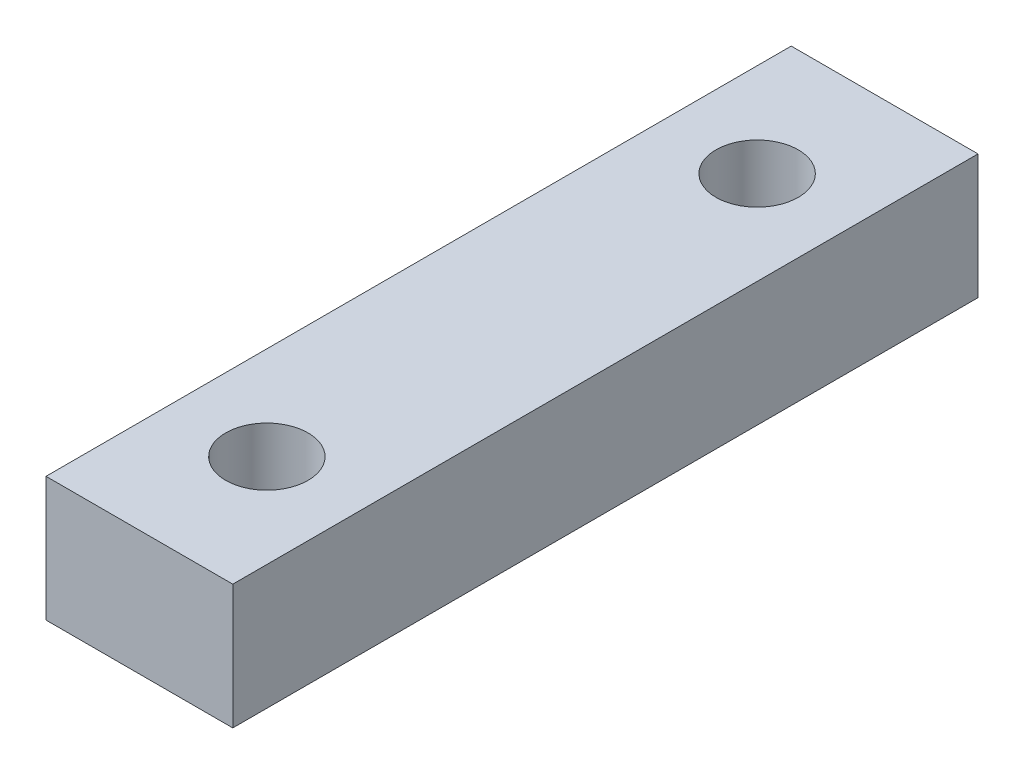
ISO-10303-21;
HEADER;
FILE_DESCRIPTION(('STEP AP214'),'2;1');
FILE_NAME('part.step','',(''),(''),'','','');
FILE_SCHEMA(('AUTOMOTIVE_DESIGN { 1 0 10303 214 1 1 1 1 }'));
ENDSEC;
DATA;
#1=APPLICATION_CONTEXT('core data for automotive mechanical design processes');
#2=APPLICATION_PROTOCOL_DEFINITION('international standard','automotive_design',2000,#1);
#3=PRODUCT_CONTEXT('',#1,'mechanical');
#4=PRODUCT('Part','Part','',(#3));
#5=PRODUCT_RELATED_PRODUCT_CATEGORY('part','',(#4));
#6=PRODUCT_DEFINITION_FORMATION('','',#4);
#7=PRODUCT_DEFINITION_CONTEXT('part definition',#1,'design');
#8=PRODUCT_DEFINITION('design','',#6,#7);
#9=PRODUCT_DEFINITION_SHAPE('','',#8);
#10=(LENGTH_UNIT() NAMED_UNIT(*) SI_UNIT(.MILLI.,.METRE.));
#11=(NAMED_UNIT(*) PLANE_ANGLE_UNIT() SI_UNIT($,.RADIAN.));
#12=(NAMED_UNIT(*) SI_UNIT($,.STERADIAN.) SOLID_ANGLE_UNIT());
#13=UNCERTAINTY_MEASURE_WITH_UNIT(LENGTH_MEASURE(1.E-05),#10,'distance_accuracy_value','');
#14=(GEOMETRIC_REPRESENTATION_CONTEXT(3) GLOBAL_UNCERTAINTY_ASSIGNED_CONTEXT((#13)) GLOBAL_UNIT_ASSIGNED_CONTEXT((#10,
#11,#12)) REPRESENTATION_CONTEXT('',''));
#15=CARTESIAN_POINT('',(0.,0.,0.));
#16=DIRECTION('',(0.,0.,1.));
#17=DIRECTION('',(1.,0.,0.));
#18=AXIS2_PLACEMENT_3D('',#15,#16,#17);
#19=CARTESIAN_POINT('',(-4.7625,3.175,19.));
#20=DIRECTION('',(1.,0.,0.));
#21=DIRECTION('',(0.,1.,0.));
#22=AXIS2_PLACEMENT_3D('',#19,#20,#21);
#23=PLANE('',#22);
#24=DIRECTION('',(0.,-1.,0.));
#25=VECTOR('',#24,1.);
#26=CARTESIAN_POINT('',(-4.7625,3.175,-19.));
#27=LINE('',#26,#25);
#28=CARTESIAN_POINT('',(-4.7625,3.175,-19.));
#29=VERTEX_POINT('',#28);
#30=CARTESIAN_POINT('',(-4.7625,-3.175,-19.));
#31=VERTEX_POINT('',#30);
#32=EDGE_CURVE('E99',#29,#31,#27,.T.);
#33=ORIENTED_EDGE('',*,*,#32,.T.);
#34=DIRECTION('',(0.,0.,-1.));
#35=VECTOR('',#34,1.);
#36=CARTESIAN_POINT('',(-4.7625,-3.175,19.));
#37=LINE('',#36,#35);
#38=CARTESIAN_POINT('',(-4.7625,-3.175,19.));
#39=VERTEX_POINT('',#38);
#40=EDGE_CURVE('E11',#39,#31,#37,.T.);
#41=ORIENTED_EDGE('',*,*,#40,.F.);
#42=DIRECTION('',(0.,-1.,0.));
#43=VECTOR('',#42,1.);
#44=CARTESIAN_POINT('',(-4.7625,3.175,19.));
#45=LINE('',#44,#43);
#46=CARTESIAN_POINT('',(-4.7625,3.175,19.));
#47=VERTEX_POINT('',#46);
#48=EDGE_CURVE('E87',#47,#39,#45,.T.);
#49=ORIENTED_EDGE('',*,*,#48,.F.);
#50=DIRECTION('',(0.,0.,-1.));
#51=VECTOR('',#50,1.);
#52=CARTESIAN_POINT('',(-4.7625,3.175,19.));
#53=LINE('',#52,#51);
#54=EDGE_CURVE('E95',#47,#29,#53,.T.);
#55=ORIENTED_EDGE('',*,*,#54,.T.);
#56=EDGE_LOOP('',(#33,#41,#49,#55));
#57=FACE_BOUND('',#56,.T.);
#58=ADVANCED_FACE('F36',(#57),#23,.F.);
#59=CARTESIAN_POINT('',(-4.7625,-3.175,19.));
#60=DIRECTION('',(0.,1.,0.));
#61=DIRECTION('',(0.,0.,1.));
#62=AXIS2_PLACEMENT_3D('',#59,#60,#61);
#63=PLANE('',#62);
#64=CARTESIAN_POINT('',(0.,-3.175,12.5));
#65=DIRECTION('',(0.,1.,0.));
#66=DIRECTION('',(0.,0.,1.));
#67=AXIS2_PLACEMENT_3D('',#64,#65,#66);
#68=CIRCLE('',#67,2.1);
#69=CARTESIAN_POINT('',(0.,-3.175,14.6));
#70=VERTEX_POINT('',#69);
#71=EDGE_CURVE('E118',#70,#70,#68,.T.);
#72=ORIENTED_EDGE('',*,*,#71,.T.);
#73=EDGE_LOOP('',(#72));
#74=FACE_BOUND('',#73,.T.);
#75=CARTESIAN_POINT('',(0.,-3.175,-12.5));
#76=DIRECTION('',(0.,1.,0.));
#77=DIRECTION('',(0.,0.,1.));
#78=AXIS2_PLACEMENT_3D('',#75,#76,#77);
#79=CIRCLE('',#78,2.1);
#80=CARTESIAN_POINT('',(0.,-3.175,-10.4));
#81=VERTEX_POINT('',#80);
#82=EDGE_CURVE('E102',#81,#81,#79,.T.);
#83=ORIENTED_EDGE('',*,*,#82,.T.);
#84=EDGE_LOOP('',(#83));
#85=FACE_BOUND('',#84,.T.);
#86=DIRECTION('',(1.,0.,0.));
#87=VECTOR('',#86,1.);
#88=CARTESIAN_POINT('',(-4.7625,-3.175,-19.));
#89=LINE('',#88,#87);
#90=CARTESIAN_POINT('',(4.7625,-3.175,-19.));
#91=VERTEX_POINT('',#90);
#92=EDGE_CURVE('E91',#31,#91,#89,.T.);
#93=ORIENTED_EDGE('',*,*,#92,.T.);
#94=DIRECTION('',(0.,0.,-1.));
#95=VECTOR('',#94,1.);
#96=CARTESIAN_POINT('',(4.7625,-3.175,19.));
#97=LINE('',#96,#95);
#98=CARTESIAN_POINT('',(4.7625,-3.175,19.));
#99=VERTEX_POINT('',#98);
#100=EDGE_CURVE('E44',#99,#91,#97,.T.);
#101=ORIENTED_EDGE('',*,*,#100,.F.);
#102=DIRECTION('',(1.,0.,0.));
#103=VECTOR('',#102,1.);
#104=CARTESIAN_POINT('',(-4.7625,-3.175,19.));
#105=LINE('',#104,#103);
#106=EDGE_CURVE('E82',#39,#99,#105,.T.);
#107=ORIENTED_EDGE('',*,*,#106,.F.);
#108=ORIENTED_EDGE('',*,*,#40,.T.);
#109=EDGE_LOOP('',(#93,#101,#107,#108));
#110=FACE_BOUND('',#109,.T.);
#111=ADVANCED_FACE('F90',(#74,#85,#110),#63,.F.);
#112=CARTESIAN_POINT('',(4.7625,3.175,19.));
#113=DIRECTION('',(-1.,0.,0.));
#114=DIRECTION('',(0.,-1.,0.));
#115=AXIS2_PLACEMENT_3D('',#112,#113,#114);
#116=PLANE('',#115);
#117=DIRECTION('',(0.,1.,0.));
#118=VECTOR('',#117,1.);
#119=CARTESIAN_POINT('',(4.7625,3.175,-19.));
#120=LINE('',#119,#118);
#121=CARTESIAN_POINT('',(4.7625,3.175,-19.));
#122=VERTEX_POINT('',#121);
#123=EDGE_CURVE('E69',#91,#122,#120,.T.);
#124=ORIENTED_EDGE('',*,*,#123,.T.);
#125=DIRECTION('',(0.,0.,-1.));
#126=VECTOR('',#125,1.);
#127=CARTESIAN_POINT('',(4.7625,3.175,19.));
#128=LINE('',#127,#126);
#129=CARTESIAN_POINT('',(4.7625,3.175,19.));
#130=VERTEX_POINT('',#129);
#131=EDGE_CURVE('E92',#130,#122,#128,.T.);
#132=ORIENTED_EDGE('',*,*,#131,.F.);
#133=DIRECTION('',(0.,1.,0.));
#134=VECTOR('',#133,1.);
#135=CARTESIAN_POINT('',(4.7625,3.175,19.));
#136=LINE('',#135,#134);
#137=EDGE_CURVE('E85',#99,#130,#136,.T.);
#138=ORIENTED_EDGE('',*,*,#137,.F.);
#139=ORIENTED_EDGE('',*,*,#100,.T.);
#140=EDGE_LOOP('',(#124,#132,#138,#139));
#141=FACE_BOUND('',#140,.T.);
#142=ADVANCED_FACE('F93',(#141),#116,.F.);
#143=CARTESIAN_POINT('',(-4.7625,3.175,19.));
#144=DIRECTION('',(0.,-1.,0.));
#145=DIRECTION('',(1.,0.,0.));
#146=AXIS2_PLACEMENT_3D('',#143,#144,#145);
#147=PLANE('',#146);
#148=CARTESIAN_POINT('',(0.,3.175,12.5));
#149=DIRECTION('',(0.,1.,0.));
#150=DIRECTION('',(0.,0.,1.));
#151=AXIS2_PLACEMENT_3D('',#148,#149,#150);
#152=CIRCLE('',#151,2.09999999999999);
#153=CARTESIAN_POINT('',(0.,3.175,14.6));
#154=VERTEX_POINT('',#153);
#155=EDGE_CURVE('E121',#154,#154,#152,.T.);
#156=ORIENTED_EDGE('',*,*,#155,.F.);
#157=EDGE_LOOP('',(#156));
#158=FACE_BOUND('',#157,.T.);
#159=CARTESIAN_POINT('',(0.,3.175,-12.5));
#160=DIRECTION('',(0.,1.,0.));
#161=DIRECTION('',(0.,0.,1.));
#162=AXIS2_PLACEMENT_3D('',#159,#160,#161);
#163=CIRCLE('',#162,2.09999999999999);
#164=CARTESIAN_POINT('',(0.,3.175,-10.4));
#165=VERTEX_POINT('',#164);
#166=EDGE_CURVE('E115',#165,#165,#163,.T.);
#167=ORIENTED_EDGE('',*,*,#166,.F.);
#168=EDGE_LOOP('',(#167));
#169=FACE_BOUND('',#168,.T.);
#170=DIRECTION('',(-1.,0.,0.));
#171=VECTOR('',#170,1.);
#172=CARTESIAN_POINT('',(-4.7625,3.175,-19.));
#173=LINE('',#172,#171);
#174=EDGE_CURVE('E75',#122,#29,#173,.T.);
#175=ORIENTED_EDGE('',*,*,#174,.T.);
#176=ORIENTED_EDGE('',*,*,#54,.F.);
#177=DIRECTION('',(-1.,0.,0.));
#178=VECTOR('',#177,1.);
#179=CARTESIAN_POINT('',(-4.7625,3.175,19.));
#180=LINE('',#179,#178);
#181=EDGE_CURVE('E52',#130,#47,#180,.T.);
#182=ORIENTED_EDGE('',*,*,#181,.F.);
#183=ORIENTED_EDGE('',*,*,#131,.T.);
#184=EDGE_LOOP('',(#175,#176,#182,#183));
#185=FACE_BOUND('',#184,.T.);
#186=ADVANCED_FACE('F107',(#158,#169,#185),#147,.F.);
#187=CARTESIAN_POINT('',(0.,0.,19.));
#188=DIRECTION('',(0.,0.,1.));
#189=DIRECTION('',(1.,0.,0.));
#190=AXIS2_PLACEMENT_3D('',#187,#188,#189);
#191=PLANE('',#190);
#192=ORIENTED_EDGE('',*,*,#48,.T.);
#193=ORIENTED_EDGE('',*,*,#106,.T.);
#194=ORIENTED_EDGE('',*,*,#137,.T.);
#195=ORIENTED_EDGE('',*,*,#181,.T.);
#196=EDGE_LOOP('',(#192,#193,#194,#195));
#197=FACE_BOUND('',#196,.T.);
#198=ADVANCED_FACE('F83',(#197),#191,.T.);
#199=CARTESIAN_POINT('',(0.,0.,-19.));
#200=DIRECTION('',(0.,0.,1.));
#201=DIRECTION('',(1.,0.,0.));
#202=AXIS2_PLACEMENT_3D('',#199,#200,#201);
#203=PLANE('',#202);
#204=ORIENTED_EDGE('',*,*,#32,.F.);
#205=ORIENTED_EDGE('',*,*,#174,.F.);
#206=ORIENTED_EDGE('',*,*,#123,.F.);
#207=ORIENTED_EDGE('',*,*,#92,.F.);
#208=EDGE_LOOP('',(#204,#205,#206,#207));
#209=FACE_BOUND('',#208,.T.);
#210=ADVANCED_FACE('F110',(#209),#203,.F.);
#211=CARTESIAN_POINT('',(0.,3.175,-12.5));
#212=DIRECTION('',(0.,1.,0.));
#213=DIRECTION('',(0.,0.,1.));
#214=AXIS2_PLACEMENT_3D('',#211,#212,#213);
#215=CYLINDRICAL_SURFACE('',#214,2.09999999999999);
#216=ORIENTED_EDGE('',*,*,#82,.F.);
#217=EDGE_LOOP('',(#216));
#218=FACE_BOUND('',#217,.T.);
#219=ORIENTED_EDGE('',*,*,#166,.T.);
#220=EDGE_LOOP('',(#219));
#221=FACE_BOUND('',#220,.T.);
#222=ADVANCED_FACE('F132',(#218,#221),#215,.F.);
#223=CARTESIAN_POINT('',(0.,3.175,12.5));
#224=DIRECTION('',(0.,1.,0.));
#225=DIRECTION('',(0.,0.,1.));
#226=AXIS2_PLACEMENT_3D('',#223,#224,#225);
#227=CYLINDRICAL_SURFACE('',#226,2.09999999999999);
#228=ORIENTED_EDGE('',*,*,#71,.F.);
#229=EDGE_LOOP('',(#228));
#230=FACE_BOUND('',#229,.T.);
#231=ORIENTED_EDGE('',*,*,#155,.T.);
#232=EDGE_LOOP('',(#231));
#233=FACE_BOUND('',#232,.T.);
#234=ADVANCED_FACE('F125',(#230,#233),#227,.F.);
#235=CLOSED_SHELL('',(#58,#111,#142,#186,#198,#210,#222,#234));
#236=MANIFOLD_SOLID_BREP('B2',#235);
#237=ADVANCED_BREP_SHAPE_REPRESENTATION('',(#18,#236),#14);
#238=SHAPE_DEFINITION_REPRESENTATION(#9,#237);
ENDSEC;
END-ISO-10303-21;
